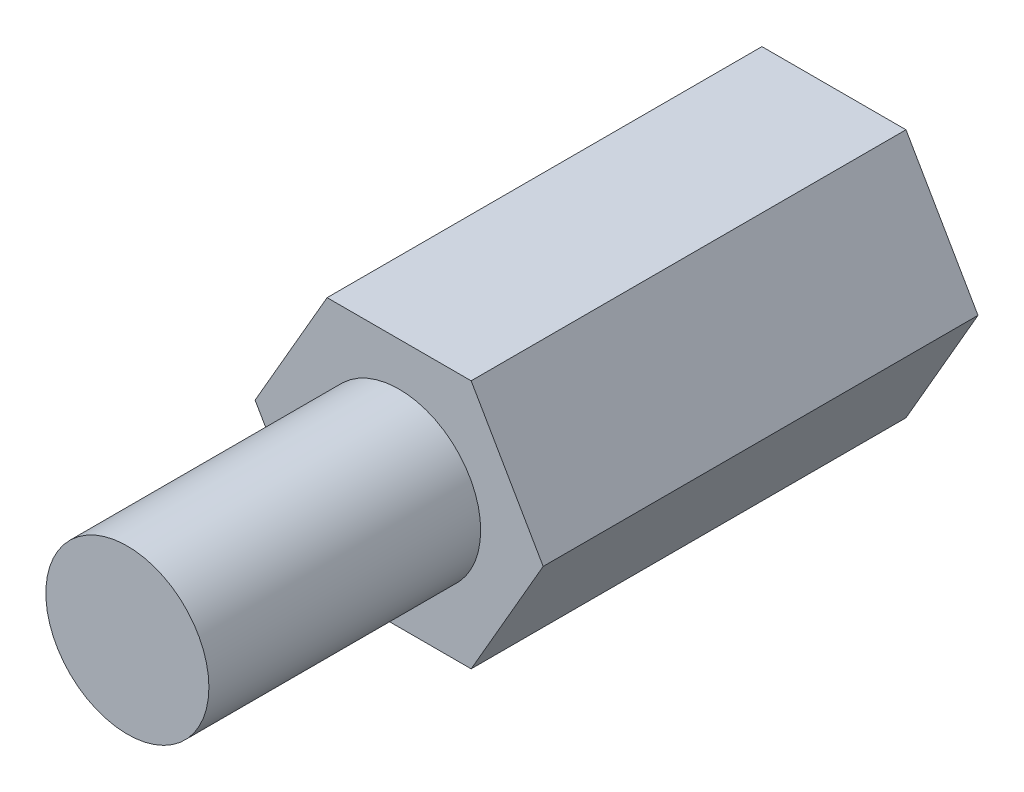
ISO-10303-21;
HEADER;
FILE_DESCRIPTION(('STEP AP214'),'2;1');
FILE_NAME('part.step','',(''),(''),'','','');
FILE_SCHEMA(('AUTOMOTIVE_DESIGN { 1 0 10303 214 1 1 1 1 }'));
ENDSEC;
DATA;
#1=APPLICATION_CONTEXT('core data for automotive mechanical design processes');
#2=APPLICATION_PROTOCOL_DEFINITION('international standard','automotive_design',2000,#1);
#3=PRODUCT_CONTEXT('',#1,'mechanical');
#4=PRODUCT('Part','Part','',(#3));
#5=PRODUCT_RELATED_PRODUCT_CATEGORY('part','',(#4));
#6=PRODUCT_DEFINITION_FORMATION('','',#4);
#7=PRODUCT_DEFINITION_CONTEXT('part definition',#1,'design');
#8=PRODUCT_DEFINITION('design','',#6,#7);
#9=PRODUCT_DEFINITION_SHAPE('','',#8);
#10=(LENGTH_UNIT() NAMED_UNIT(*) SI_UNIT(.MILLI.,.METRE.));
#11=(NAMED_UNIT(*) PLANE_ANGLE_UNIT() SI_UNIT($,.RADIAN.));
#12=(NAMED_UNIT(*) SI_UNIT($,.STERADIAN.) SOLID_ANGLE_UNIT());
#13=UNCERTAINTY_MEASURE_WITH_UNIT(LENGTH_MEASURE(1.E-05),#10,'distance_accuracy_value','');
#14=(GEOMETRIC_REPRESENTATION_CONTEXT(3) GLOBAL_UNCERTAINTY_ASSIGNED_CONTEXT((#13)) GLOBAL_UNIT_ASSIGNED_CONTEXT((#10,
#11,#12)) REPRESENTATION_CONTEXT('',''));
#15=CARTESIAN_POINT('',(0.,0.,0.));
#16=DIRECTION('',(0.,0.,1.));
#17=DIRECTION('',(1.,0.,0.));
#18=AXIS2_PLACEMENT_3D('',#15,#16,#17);
#19=CARTESIAN_POINT('',(2.65,0.,8.));
#20=DIRECTION('',(-0.866025403784438,-0.5,0.));
#21=DIRECTION('',(0.5,-0.866025403784439,0.));
#22=AXIS2_PLACEMENT_3D('',#19,#20,#21);
#23=PLANE('',#22);
#24=DIRECTION('',(-0.5,0.866025403784438,0.));
#25=VECTOR('',#24,1.);
#26=CARTESIAN_POINT('',(2.65,0.,0.));
#27=LINE('',#26,#25);
#28=CARTESIAN_POINT('',(2.65,0.,0.));
#29=VERTEX_POINT('',#28);
#30=CARTESIAN_POINT('',(1.325,2.29496732002876,0.));
#31=VERTEX_POINT('',#30);
#32=EDGE_CURVE('E119',#29,#31,#27,.T.);
#33=ORIENTED_EDGE('',*,*,#32,.T.);
#34=DIRECTION('',(0.,0.,-1.));
#35=VECTOR('',#34,1.);
#36=CARTESIAN_POINT('',(1.325,2.29496732002876,8.));
#37=LINE('',#36,#35);
#38=CARTESIAN_POINT('',(1.325,2.29496732002876,8.));
#39=VERTEX_POINT('',#38);
#40=EDGE_CURVE('E36',#39,#31,#37,.T.);
#41=ORIENTED_EDGE('',*,*,#40,.F.);
#42=DIRECTION('',(-0.5,0.866025403784438,0.));
#43=VECTOR('',#42,1.);
#44=CARTESIAN_POINT('',(2.65,0.,8.));
#45=LINE('',#44,#43);
#46=CARTESIAN_POINT('',(2.65,0.,8.));
#47=VERTEX_POINT('',#46);
#48=EDGE_CURVE('E130',#47,#39,#45,.T.);
#49=ORIENTED_EDGE('',*,*,#48,.F.);
#50=DIRECTION('',(0.,0.,-1.));
#51=VECTOR('',#50,1.);
#52=CARTESIAN_POINT('',(2.65,0.,8.));
#53=LINE('',#52,#51);
#54=EDGE_CURVE('E115',#47,#29,#53,.T.);
#55=ORIENTED_EDGE('',*,*,#54,.T.);
#56=EDGE_LOOP('',(#33,#41,#49,#55));
#57=FACE_BOUND('',#56,.T.);
#58=ADVANCED_FACE('F33',(#57),#23,.F.);
#59=CARTESIAN_POINT('',(1.325,2.29496732002876,8.));
#60=DIRECTION('',(0.,-1.,0.));
#61=DIRECTION('',(1.,0.,0.));
#62=AXIS2_PLACEMENT_3D('',#59,#60,#61);
#63=PLANE('',#62);
#64=DIRECTION('',(-1.,0.,0.));
#65=VECTOR('',#64,1.);
#66=CARTESIAN_POINT('',(1.325,2.29496732002876,0.));
#67=LINE('',#66,#65);
#68=CARTESIAN_POINT('',(-1.325,2.29496732002876,0.));
#69=VERTEX_POINT('',#68);
#70=EDGE_CURVE('E122',#31,#69,#67,.T.);
#71=ORIENTED_EDGE('',*,*,#70,.T.);
#72=DIRECTION('',(0.,0.,-1.));
#73=VECTOR('',#72,1.);
#74=CARTESIAN_POINT('',(-1.325,2.29496732002876,8.));
#75=LINE('',#74,#73);
#76=CARTESIAN_POINT('',(-1.325,2.29496732002876,8.));
#77=VERTEX_POINT('',#76);
#78=EDGE_CURVE('E133',#77,#69,#75,.T.);
#79=ORIENTED_EDGE('',*,*,#78,.F.);
#80=DIRECTION('',(-1.,0.,0.));
#81=VECTOR('',#80,1.);
#82=CARTESIAN_POINT('',(1.325,2.29496732002876,8.));
#83=LINE('',#82,#81);
#84=EDGE_CURVE('E88',#39,#77,#83,.T.);
#85=ORIENTED_EDGE('',*,*,#84,.F.);
#86=ORIENTED_EDGE('',*,*,#40,.T.);
#87=EDGE_LOOP('',(#71,#79,#85,#86));
#88=FACE_BOUND('',#87,.T.);
#89=ADVANCED_FACE('F138',(#88),#63,.F.);
#90=CARTESIAN_POINT('',(-1.325,2.29496732002876,8.));
#91=DIRECTION('',(0.866025403784439,-0.5,0.));
#92=DIRECTION('',(0.5,0.866025403784439,0.));
#93=AXIS2_PLACEMENT_3D('',#90,#91,#92);
#94=PLANE('',#93);
#95=DIRECTION('',(-0.5,-0.866025403784439,0.));
#96=VECTOR('',#95,1.);
#97=CARTESIAN_POINT('',(-1.325,2.29496732002876,0.));
#98=LINE('',#97,#96);
#99=CARTESIAN_POINT('',(-2.65,0.,0.));
#100=VERTEX_POINT('',#99);
#101=EDGE_CURVE('E125',#69,#100,#98,.T.);
#102=ORIENTED_EDGE('',*,*,#101,.T.);
#103=DIRECTION('',(0.,0.,-1.));
#104=VECTOR('',#103,1.);
#105=CARTESIAN_POINT('',(-2.65,0.,8.));
#106=LINE('',#105,#104);
#107=CARTESIAN_POINT('',(-2.65,0.,8.));
#108=VERTEX_POINT('',#107);
#109=EDGE_CURVE('E110',#108,#100,#106,.T.);
#110=ORIENTED_EDGE('',*,*,#109,.F.);
#111=DIRECTION('',(-0.5,-0.866025403784439,0.));
#112=VECTOR('',#111,1.);
#113=CARTESIAN_POINT('',(-1.325,2.29496732002876,8.));
#114=LINE('',#113,#112);
#115=EDGE_CURVE('E101',#77,#108,#114,.T.);
#116=ORIENTED_EDGE('',*,*,#115,.F.);
#117=ORIENTED_EDGE('',*,*,#78,.T.);
#118=EDGE_LOOP('',(#102,#110,#116,#117));
#119=FACE_BOUND('',#118,.T.);
#120=ADVANCED_FACE('F144',(#119),#94,.F.);
#121=CARTESIAN_POINT('',(-2.65,0.,8.));
#122=DIRECTION('',(0.866025403784439,0.5,0.));
#123=DIRECTION('',(-0.5,0.866025403784439,0.));
#124=AXIS2_PLACEMENT_3D('',#121,#122,#123);
#125=PLANE('',#124);
#126=DIRECTION('',(0.5,-0.866025403784439,0.));
#127=VECTOR('',#126,1.);
#128=CARTESIAN_POINT('',(-2.65,0.,0.));
#129=LINE('',#128,#127);
#130=CARTESIAN_POINT('',(-1.325,-2.29496732002876,0.));
#131=VERTEX_POINT('',#130);
#132=EDGE_CURVE('E109',#100,#131,#129,.T.);
#133=ORIENTED_EDGE('',*,*,#132,.T.);
#134=DIRECTION('',(0.,0.,-1.));
#135=VECTOR('',#134,1.);
#136=CARTESIAN_POINT('',(-1.325,-2.29496732002876,8.));
#137=LINE('',#136,#135);
#138=CARTESIAN_POINT('',(-1.325,-2.29496732002876,8.));
#139=VERTEX_POINT('',#138);
#140=EDGE_CURVE('E106',#139,#131,#137,.T.);
#141=ORIENTED_EDGE('',*,*,#140,.F.);
#142=DIRECTION('',(0.5,-0.866025403784439,0.));
#143=VECTOR('',#142,1.);
#144=CARTESIAN_POINT('',(-2.65,0.,8.));
#145=LINE('',#144,#143);
#146=EDGE_CURVE('E95',#108,#139,#145,.T.);
#147=ORIENTED_EDGE('',*,*,#146,.F.);
#148=ORIENTED_EDGE('',*,*,#109,.T.);
#149=EDGE_LOOP('',(#133,#141,#147,#148));
#150=FACE_BOUND('',#149,.T.);
#151=ADVANCED_FACE('F107',(#150),#125,.F.);
#152=CARTESIAN_POINT('',(-1.325,-2.29496732002876,8.));
#153=DIRECTION('',(0.,1.,0.));
#154=DIRECTION('',(0.,0.,1.));
#155=AXIS2_PLACEMENT_3D('',#152,#153,#154);
#156=PLANE('',#155);
#157=DIRECTION('',(1.,0.,0.));
#158=VECTOR('',#157,1.);
#159=CARTESIAN_POINT('',(-1.325,-2.29496732002876,0.));
#160=LINE('',#159,#158);
#161=CARTESIAN_POINT('',(1.325,-2.29496732002876,0.));
#162=VERTEX_POINT('',#161);
#163=EDGE_CURVE('E73',#131,#162,#160,.T.);
#164=ORIENTED_EDGE('',*,*,#163,.T.);
#165=DIRECTION('',(0.,0.,-1.));
#166=VECTOR('',#165,1.);
#167=CARTESIAN_POINT('',(1.325,-2.29496732002876,8.));
#168=LINE('',#167,#166);
#169=CARTESIAN_POINT('',(1.325,-2.29496732002876,8.));
#170=VERTEX_POINT('',#169);
#171=EDGE_CURVE('E111',#170,#162,#168,.T.);
#172=ORIENTED_EDGE('',*,*,#171,.F.);
#173=DIRECTION('',(1.,0.,0.));
#174=VECTOR('',#173,1.);
#175=CARTESIAN_POINT('',(-1.325,-2.29496732002876,8.));
#176=LINE('',#175,#174);
#177=EDGE_CURVE('E99',#139,#170,#176,.T.);
#178=ORIENTED_EDGE('',*,*,#177,.F.);
#179=ORIENTED_EDGE('',*,*,#140,.T.);
#180=EDGE_LOOP('',(#164,#172,#178,#179));
#181=FACE_BOUND('',#180,.T.);
#182=ADVANCED_FACE('F113',(#181),#156,.F.);
#183=CARTESIAN_POINT('',(1.325,-2.29496732002876,8.));
#184=DIRECTION('',(-0.866025403784439,0.5,0.));
#185=DIRECTION('',(-0.5,-0.866025403784439,0.));
#186=AXIS2_PLACEMENT_3D('',#183,#184,#185);
#187=PLANE('',#186);
#188=DIRECTION('',(0.5,0.866025403784439,0.));
#189=VECTOR('',#188,1.);
#190=CARTESIAN_POINT('',(1.325,-2.29496732002876,0.));
#191=LINE('',#190,#189);
#192=EDGE_CURVE('E79',#162,#29,#191,.T.);
#193=ORIENTED_EDGE('',*,*,#192,.T.);
#194=ORIENTED_EDGE('',*,*,#54,.F.);
#195=DIRECTION('',(0.5,0.866025403784439,0.));
#196=VECTOR('',#195,1.);
#197=CARTESIAN_POINT('',(1.325,-2.29496732002876,8.));
#198=LINE('',#197,#196);
#199=EDGE_CURVE('E50',#170,#47,#198,.T.);
#200=ORIENTED_EDGE('',*,*,#199,.F.);
#201=ORIENTED_EDGE('',*,*,#171,.T.);
#202=EDGE_LOOP('',(#193,#194,#200,#201));
#203=FACE_BOUND('',#202,.T.);
#204=ADVANCED_FACE('F167',(#203),#187,.F.);
#205=CARTESIAN_POINT('',(0.,0.,8.));
#206=DIRECTION('',(0.,0.,1.));
#207=DIRECTION('',(1.,0.,0.));
#208=AXIS2_PLACEMENT_3D('',#205,#206,#207);
#209=PLANE('',#208);
#210=CARTESIAN_POINT('',(0.,0.,8.));
#211=DIRECTION('',(0.,0.,1.));
#212=DIRECTION('',(1.,0.,0.));
#213=AXIS2_PLACEMENT_3D('',#210,#211,#212);
#214=CIRCLE('',#213,1.5);
#215=CARTESIAN_POINT('',(1.5,0.,8.));
#216=VERTEX_POINT('',#215);
#217=EDGE_CURVE('E11',#216,#216,#214,.T.);
#218=ORIENTED_EDGE('',*,*,#217,.F.);
#219=EDGE_LOOP('',(#218));
#220=FACE_BOUND('',#219,.T.);
#221=ORIENTED_EDGE('',*,*,#48,.T.);
#222=ORIENTED_EDGE('',*,*,#84,.T.);
#223=ORIENTED_EDGE('',*,*,#115,.T.);
#224=ORIENTED_EDGE('',*,*,#146,.T.);
#225=ORIENTED_EDGE('',*,*,#177,.T.);
#226=ORIENTED_EDGE('',*,*,#199,.T.);
#227=EDGE_LOOP('',(#221,#222,#223,#224,#225,#226));
#228=FACE_BOUND('',#227,.T.);
#229=ADVANCED_FACE('F97',(#220,#228),#209,.T.);
#230=CARTESIAN_POINT('',(0.,0.,0.));
#231=DIRECTION('',(0.,0.,1.));
#232=DIRECTION('',(1.,0.,0.));
#233=AXIS2_PLACEMENT_3D('',#230,#231,#232);
#234=PLANE('',#233);
#235=CARTESIAN_POINT('',(0.,0.,0.));
#236=DIRECTION('',(0.,0.,-1.));
#237=DIRECTION('',(-1.,0.,0.));
#238=AXIS2_PLACEMENT_3D('',#235,#236,#237);
#239=CIRCLE('',#238,1.25);
#240=CARTESIAN_POINT('',(-1.25,0.,0.));
#241=VERTEX_POINT('',#240);
#242=EDGE_CURVE('E148',#241,#241,#239,.T.);
#243=ORIENTED_EDGE('',*,*,#242,.F.);
#244=EDGE_LOOP('',(#243));
#245=FACE_BOUND('',#244,.T.);
#246=ORIENTED_EDGE('',*,*,#32,.F.);
#247=ORIENTED_EDGE('',*,*,#192,.F.);
#248=ORIENTED_EDGE('',*,*,#163,.F.);
#249=ORIENTED_EDGE('',*,*,#132,.F.);
#250=ORIENTED_EDGE('',*,*,#101,.F.);
#251=ORIENTED_EDGE('',*,*,#70,.F.);
#252=EDGE_LOOP('',(#246,#247,#248,#249,#250,#251));
#253=FACE_BOUND('',#252,.T.);
#254=ADVANCED_FACE('F143',(#245,#253),#234,.F.);
#255=CARTESIAN_POINT('',(0.,0.,3.));
#256=DIRECTION('',(0.,0.,-1.));
#257=DIRECTION('',(-1.,0.,0.));
#258=AXIS2_PLACEMENT_3D('',#255,#256,#257);
#259=CYLINDRICAL_SURFACE('',#258,1.25);
#260=CARTESIAN_POINT('',(0.,0.,3.));
#261=DIRECTION('',(0.,0.,-1.));
#262=DIRECTION('',(-1.,0.,0.));
#263=AXIS2_PLACEMENT_3D('',#260,#261,#262);
#264=CIRCLE('',#263,1.25);
#265=CARTESIAN_POINT('',(-1.25,0.,3.));
#266=VERTEX_POINT('',#265);
#267=EDGE_CURVE('E123',#266,#266,#264,.T.);
#268=ORIENTED_EDGE('',*,*,#267,.F.);
#269=EDGE_LOOP('',(#268));
#270=FACE_BOUND('',#269,.T.);
#271=ORIENTED_EDGE('',*,*,#242,.T.);
#272=EDGE_LOOP('',(#271));
#273=FACE_BOUND('',#272,.T.);
#274=ADVANCED_FACE('F173',(#270,#273),#259,.F.);
#275=CARTESIAN_POINT('',(0.,0.,3.));
#276=DIRECTION('',(0.,0.,-1.));
#277=DIRECTION('',(-1.,0.,0.));
#278=AXIS2_PLACEMENT_3D('',#275,#276,#277);
#279=PLANE('',#278);
#280=ORIENTED_EDGE('',*,*,#267,.T.);
#281=EDGE_LOOP('',(#280));
#282=FACE_BOUND('',#281,.T.);
#283=ADVANCED_FACE('F162',(#282),#279,.T.);
#284=CARTESIAN_POINT('',(0.,0.,13.));
#285=DIRECTION('',(0.,0.,-1.));
#286=DIRECTION('',(-1.,0.,0.));
#287=AXIS2_PLACEMENT_3D('',#284,#285,#286);
#288=CYLINDRICAL_SURFACE('',#287,1.5);
#289=CARTESIAN_POINT('',(0.,0.,13.));
#290=DIRECTION('',(0.,0.,1.));
#291=DIRECTION('',(1.,0.,0.));
#292=AXIS2_PLACEMENT_3D('',#289,#290,#291);
#293=CIRCLE('',#292,1.5);
#294=CARTESIAN_POINT('',(1.5,0.,13.));
#295=VERTEX_POINT('',#294);
#296=EDGE_CURVE('E151',#295,#295,#293,.T.);
#297=ORIENTED_EDGE('',*,*,#296,.F.);
#298=EDGE_LOOP('',(#297));
#299=FACE_BOUND('',#298,.T.);
#300=ORIENTED_EDGE('',*,*,#217,.T.);
#301=EDGE_LOOP('',(#300));
#302=FACE_BOUND('',#301,.T.);
#303=ADVANCED_FACE('F159',(#299,#302),#288,.T.);
#304=CARTESIAN_POINT('',(0.,0.,13.));
#305=DIRECTION('',(0.,0.,1.));
#306=DIRECTION('',(1.,0.,0.));
#307=AXIS2_PLACEMENT_3D('',#304,#305,#306);
#308=PLANE('',#307);
#309=ORIENTED_EDGE('',*,*,#296,.T.);
#310=EDGE_LOOP('',(#309));
#311=FACE_BOUND('',#310,.T.);
#312=ADVANCED_FACE('F157',(#311),#308,.T.);
#313=CLOSED_SHELL('',(#58,#89,#120,#151,#182,#204,#229,#254,#274,#283,#303,#312));
#314=MANIFOLD_SOLID_BREP('B2',#313);
#315=ADVANCED_BREP_SHAPE_REPRESENTATION('',(#18,#314),#14);
#316=SHAPE_DEFINITION_REPRESENTATION(#9,#315);
ENDSEC;
END-ISO-10303-21;
